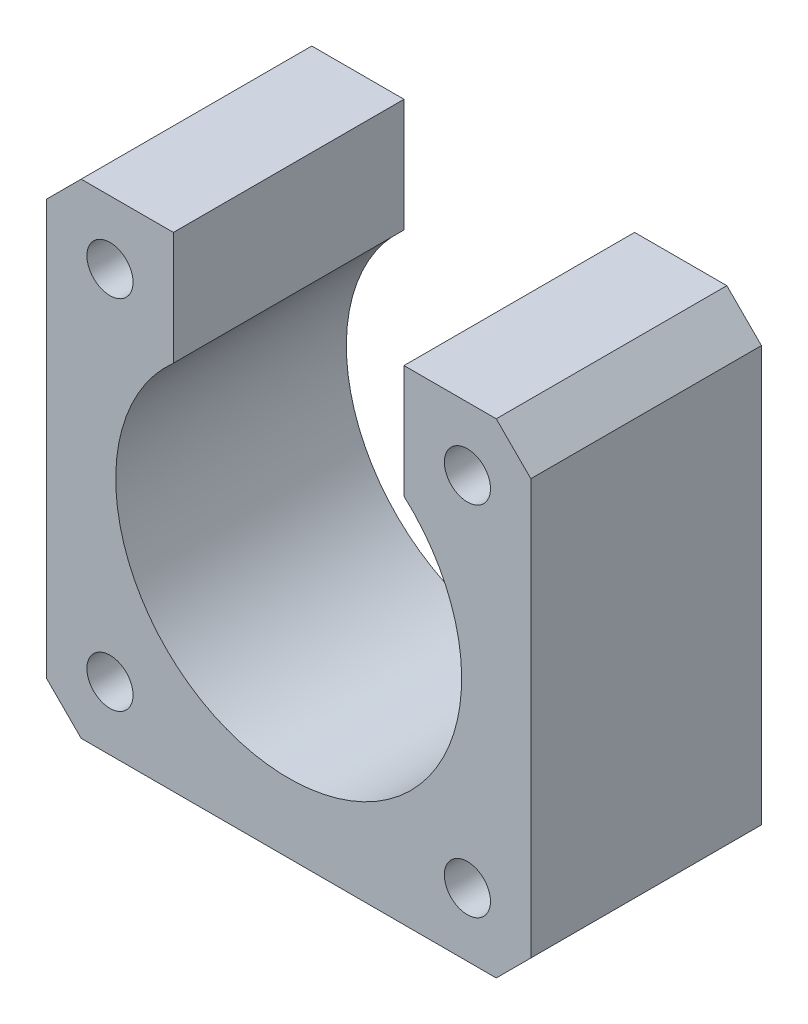
ISO-10303-21;
HEADER;
FILE_DESCRIPTION(('STEP AP214'),'2;1');
FILE_NAME('part.step','',(''),(''),'','','');
FILE_SCHEMA(('AUTOMOTIVE_DESIGN { 1 0 10303 214 1 1 1 1 }'));
ENDSEC;
DATA;
#1=APPLICATION_CONTEXT('core data for automotive mechanical design processes');
#2=APPLICATION_PROTOCOL_DEFINITION('international standard','automotive_design',2000,#1);
#3=PRODUCT_CONTEXT('',#1,'mechanical');
#4=PRODUCT('Part','Part','',(#3));
#5=PRODUCT_RELATED_PRODUCT_CATEGORY('part','',(#4));
#6=PRODUCT_DEFINITION_FORMATION('','',#4);
#7=PRODUCT_DEFINITION_CONTEXT('part definition',#1,'design');
#8=PRODUCT_DEFINITION('design','',#6,#7);
#9=PRODUCT_DEFINITION_SHAPE('','',#8);
#10=(LENGTH_UNIT() NAMED_UNIT(*) SI_UNIT(.MILLI.,.METRE.));
#11=(NAMED_UNIT(*) PLANE_ANGLE_UNIT() SI_UNIT($,.RADIAN.));
#12=(NAMED_UNIT(*) SI_UNIT($,.STERADIAN.) SOLID_ANGLE_UNIT());
#13=UNCERTAINTY_MEASURE_WITH_UNIT(LENGTH_MEASURE(1.E-05),#10,'distance_accuracy_value','');
#14=(GEOMETRIC_REPRESENTATION_CONTEXT(3) GLOBAL_UNCERTAINTY_ASSIGNED_CONTEXT((#13)) GLOBAL_UNIT_ASSIGNED_CONTEXT((#10,
#11,#12)) REPRESENTATION_CONTEXT('',''));
#15=CARTESIAN_POINT('',(0.,0.,0.));
#16=DIRECTION('',(0.,0.,1.));
#17=DIRECTION('',(1.,0.,0.));
#18=AXIS2_PLACEMENT_3D('',#15,#16,#17);
#19=CARTESIAN_POINT('',(0.,0.,20.));
#20=DIRECTION('',(0.,0.,1.));
#21=DIRECTION('',(1.,0.,0.));
#22=AXIS2_PLACEMENT_3D('',#19,#20,#21);
#23=PLANE('',#22);
#24=CARTESIAN_POINT('',(-15.5,-15.5,20.));
#25=DIRECTION('',(0.,0.,1.));
#26=DIRECTION('',(1.,0.,0.));
#27=AXIS2_PLACEMENT_3D('',#24,#25,#26);
#28=CIRCLE('',#27,2.);
#29=CARTESIAN_POINT('',(-13.5,-15.5,20.));
#30=VERTEX_POINT('',#29);
#31=EDGE_CURVE('E294',#30,#30,#28,.T.);
#32=ORIENTED_EDGE('',*,*,#31,.F.);
#33=EDGE_LOOP('',(#32));
#34=FACE_BOUND('',#33,.T.);
#35=CARTESIAN_POINT('',(15.5,15.5,20.));
#36=DIRECTION('',(0.,0.,1.));
#37=DIRECTION('',(1.,0.,0.));
#38=AXIS2_PLACEMENT_3D('',#35,#36,#37);
#39=CIRCLE('',#38,2.);
#40=CARTESIAN_POINT('',(17.5,15.5,20.));
#41=VERTEX_POINT('',#40);
#42=EDGE_CURVE('E160',#41,#41,#39,.T.);
#43=ORIENTED_EDGE('',*,*,#42,.F.);
#44=EDGE_LOOP('',(#43));
#45=FACE_BOUND('',#44,.T.);
#46=DIRECTION('',(0.,-1.,0.));
#47=VECTOR('',#46,1.);
#48=CARTESIAN_POINT('',(-21.,-18.,20.));
#49=LINE('',#48,#47);
#50=CARTESIAN_POINT('',(-21.,18.,20.));
#51=VERTEX_POINT('',#50);
#52=CARTESIAN_POINT('',(-21.,-18.,20.));
#53=VERTEX_POINT('',#52);
#54=EDGE_CURVE('E179',#51,#53,#49,.T.);
#55=ORIENTED_EDGE('',*,*,#54,.T.);
#56=DIRECTION('',(0.707106781186548,-0.707106781186548,0.));
#57=VECTOR('',#56,1.);
#58=CARTESIAN_POINT('',(-21.,-18.,20.));
#59=LINE('',#58,#57);
#60=CARTESIAN_POINT('',(-18.,-21.,20.));
#61=VERTEX_POINT('',#60);
#62=EDGE_CURVE('E107',#53,#61,#59,.T.);
#63=ORIENTED_EDGE('',*,*,#62,.T.);
#64=DIRECTION('',(1.,0.,0.));
#65=VECTOR('',#64,1.);
#66=CARTESIAN_POINT('',(-18.,-21.,20.));
#67=LINE('',#66,#65);
#68=CARTESIAN_POINT('',(18.,-21.,20.));
#69=VERTEX_POINT('',#68);
#70=EDGE_CURVE('E206',#61,#69,#67,.T.);
#71=ORIENTED_EDGE('',*,*,#70,.T.);
#72=DIRECTION('',(0.707106781186548,0.707106781186548,0.));
#73=VECTOR('',#72,1.);
#74=CARTESIAN_POINT('',(18.,-21.,20.));
#75=LINE('',#74,#73);
#76=CARTESIAN_POINT('',(21.,-18.,20.));
#77=VERTEX_POINT('',#76);
#78=EDGE_CURVE('E225',#69,#77,#75,.T.);
#79=ORIENTED_EDGE('',*,*,#78,.T.);
#80=DIRECTION('',(0.,1.,0.));
#81=VECTOR('',#80,1.);
#82=CARTESIAN_POINT('',(21.,-18.,20.));
#83=LINE('',#82,#81);
#84=CARTESIAN_POINT('',(21.,18.,20.));
#85=VERTEX_POINT('',#84);
#86=EDGE_CURVE('E222',#77,#85,#83,.T.);
#87=ORIENTED_EDGE('',*,*,#86,.T.);
#88=DIRECTION('',(-0.707106781186548,0.707106781186548,0.));
#89=VECTOR('',#88,1.);
#90=CARTESIAN_POINT('',(18.,21.,20.));
#91=LINE('',#90,#89);
#92=CARTESIAN_POINT('',(18.,21.,20.));
#93=VERTEX_POINT('',#92);
#94=EDGE_CURVE('E224',#85,#93,#91,.T.);
#95=ORIENTED_EDGE('',*,*,#94,.T.);
#96=DIRECTION('',(-1.,0.,0.));
#97=VECTOR('',#96,1.);
#98=CARTESIAN_POINT('',(10.,21.,20.));
#99=LINE('',#98,#97);
#100=CARTESIAN_POINT('',(10.,21.,20.));
#101=VERTEX_POINT('',#100);
#102=EDGE_CURVE('E227',#93,#101,#99,.T.);
#103=ORIENTED_EDGE('',*,*,#102,.T.);
#104=DIRECTION('',(0.,-1.,0.));
#105=VECTOR('',#104,1.);
#106=CARTESIAN_POINT('',(10.,21.,20.));
#107=LINE('',#106,#105);
#108=CARTESIAN_POINT('',(10.,11.180339887499,20.));
#109=VERTEX_POINT('',#108);
#110=EDGE_CURVE('E233',#101,#109,#107,.T.);
#111=ORIENTED_EDGE('',*,*,#110,.T.);
#112=CARTESIAN_POINT('',(0.,0.,20.));
#113=DIRECTION('',(0.,0.,-1.));
#114=DIRECTION('',(1.,0.,0.));
#115=AXIS2_PLACEMENT_3D('',#112,#113,#114);
#116=CIRCLE('',#115,15.);
#117=CARTESIAN_POINT('',(-10.,11.180339887499,20.));
#118=VERTEX_POINT('',#117);
#119=EDGE_CURVE('E138',#109,#118,#116,.T.);
#120=ORIENTED_EDGE('',*,*,#119,.T.);
#121=DIRECTION('',(0.,1.,0.));
#122=VECTOR('',#121,1.);
#123=CARTESIAN_POINT('',(-10.,21.,20.));
#124=LINE('',#123,#122);
#125=CARTESIAN_POINT('',(-10.,21.,20.));
#126=VERTEX_POINT('',#125);
#127=EDGE_CURVE('E132',#118,#126,#124,.T.);
#128=ORIENTED_EDGE('',*,*,#127,.T.);
#129=DIRECTION('',(-1.,0.,0.));
#130=VECTOR('',#129,1.);
#131=CARTESIAN_POINT('',(-18.,21.,20.));
#132=LINE('',#131,#130);
#133=CARTESIAN_POINT('',(-18.,21.,20.));
#134=VERTEX_POINT('',#133);
#135=EDGE_CURVE('E136',#126,#134,#132,.T.);
#136=ORIENTED_EDGE('',*,*,#135,.T.);
#137=DIRECTION('',(-0.707106781186548,-0.707106781186548,0.));
#138=VECTOR('',#137,1.);
#139=CARTESIAN_POINT('',(-21.,18.,20.));
#140=LINE('',#139,#138);
#141=EDGE_CURVE('E52',#134,#51,#140,.T.);
#142=ORIENTED_EDGE('',*,*,#141,.T.);
#143=EDGE_LOOP('',(#55,#63,#71,#79,#87,#95,#103,#111,#120,#128,#136,#142));
#144=FACE_BOUND('',#143,.T.);
#145=CARTESIAN_POINT('',(15.5,-15.5,20.));
#146=DIRECTION('',(0.,0.,1.));
#147=DIRECTION('',(1.,0.,0.));
#148=AXIS2_PLACEMENT_3D('',#145,#146,#147);
#149=CIRCLE('',#148,2.);
#150=CARTESIAN_POINT('',(17.5,-15.5,20.));
#151=VERTEX_POINT('',#150);
#152=EDGE_CURVE('E300',#151,#151,#149,.T.);
#153=ORIENTED_EDGE('',*,*,#152,.F.);
#154=EDGE_LOOP('',(#153));
#155=FACE_BOUND('',#154,.T.);
#156=CARTESIAN_POINT('',(-15.5,15.5,20.));
#157=DIRECTION('',(0.,0.,1.));
#158=DIRECTION('',(1.,0.,0.));
#159=AXIS2_PLACEMENT_3D('',#156,#157,#158);
#160=CIRCLE('',#159,2.);
#161=CARTESIAN_POINT('',(-13.5,15.5,20.));
#162=VERTEX_POINT('',#161);
#163=EDGE_CURVE('E285',#162,#162,#160,.T.);
#164=ORIENTED_EDGE('',*,*,#163,.F.);
#165=EDGE_LOOP('',(#164));
#166=FACE_BOUND('',#165,.T.);
#167=ADVANCED_FACE('F35',(#34,#45,#144,#155,#166),#23,.T.);
#168=CARTESIAN_POINT('',(0.,0.,0.));
#169=DIRECTION('',(0.,0.,1.));
#170=DIRECTION('',(1.,0.,0.));
#171=AXIS2_PLACEMENT_3D('',#168,#169,#170);
#172=PLANE('',#171);
#173=CARTESIAN_POINT('',(-15.5,-15.5,0.));
#174=DIRECTION('',(0.,0.,1.));
#175=DIRECTION('',(1.,0.,0.));
#176=AXIS2_PLACEMENT_3D('',#173,#174,#175);
#177=CIRCLE('',#176,2.);
#178=CARTESIAN_POINT('',(-13.5,-15.5,0.));
#179=VERTEX_POINT('',#178);
#180=EDGE_CURVE('E291',#179,#179,#177,.T.);
#181=ORIENTED_EDGE('',*,*,#180,.T.);
#182=EDGE_LOOP('',(#181));
#183=FACE_BOUND('',#182,.T.);
#184=CARTESIAN_POINT('',(15.5,15.5,0.));
#185=DIRECTION('',(0.,0.,1.));
#186=DIRECTION('',(1.,0.,0.));
#187=AXIS2_PLACEMENT_3D('',#184,#185,#186);
#188=CIRCLE('',#187,2.);
#189=CARTESIAN_POINT('',(17.5,15.5,0.));
#190=VERTEX_POINT('',#189);
#191=EDGE_CURVE('E303',#190,#190,#188,.T.);
#192=ORIENTED_EDGE('',*,*,#191,.T.);
#193=EDGE_LOOP('',(#192));
#194=FACE_BOUND('',#193,.T.);
#195=DIRECTION('',(0.,-1.,0.));
#196=VECTOR('',#195,1.);
#197=CARTESIAN_POINT('',(-21.,-18.,0.));
#198=LINE('',#197,#196);
#199=CARTESIAN_POINT('',(-21.,18.,0.));
#200=VERTEX_POINT('',#199);
#201=CARTESIAN_POINT('',(-21.,-18.,0.));
#202=VERTEX_POINT('',#201);
#203=EDGE_CURVE('E156',#200,#202,#198,.T.);
#204=ORIENTED_EDGE('',*,*,#203,.F.);
#205=DIRECTION('',(-0.707106781186548,-0.707106781186548,0.));
#206=VECTOR('',#205,1.);
#207=CARTESIAN_POINT('',(-21.,18.,0.));
#208=LINE('',#207,#206);
#209=CARTESIAN_POINT('',(-18.,21.,0.));
#210=VERTEX_POINT('',#209);
#211=EDGE_CURVE('E99',#210,#200,#208,.T.);
#212=ORIENTED_EDGE('',*,*,#211,.F.);
#213=DIRECTION('',(-1.,0.,0.));
#214=VECTOR('',#213,1.);
#215=CARTESIAN_POINT('',(-18.,21.,0.));
#216=LINE('',#215,#214);
#217=CARTESIAN_POINT('',(-10.,21.,0.));
#218=VERTEX_POINT('',#217);
#219=EDGE_CURVE('E93',#218,#210,#216,.T.);
#220=ORIENTED_EDGE('',*,*,#219,.F.);
#221=DIRECTION('',(0.,1.,0.));
#222=VECTOR('',#221,1.);
#223=CARTESIAN_POINT('',(-10.,21.,0.));
#224=LINE('',#223,#222);
#225=CARTESIAN_POINT('',(-10.,11.180339887499,0.));
#226=VERTEX_POINT('',#225);
#227=EDGE_CURVE('E146',#226,#218,#224,.T.);
#228=ORIENTED_EDGE('',*,*,#227,.F.);
#229=CARTESIAN_POINT('',(0.,0.,0.));
#230=DIRECTION('',(0.,0.,-1.));
#231=DIRECTION('',(1.,0.,0.));
#232=AXIS2_PLACEMENT_3D('',#229,#230,#231);
#233=CIRCLE('',#232,15.);
#234=CARTESIAN_POINT('',(10.,11.180339887499,0.));
#235=VERTEX_POINT('',#234);
#236=EDGE_CURVE('E174',#235,#226,#233,.T.);
#237=ORIENTED_EDGE('',*,*,#236,.F.);
#238=DIRECTION('',(0.,-1.,0.));
#239=VECTOR('',#238,1.);
#240=CARTESIAN_POINT('',(10.,21.,0.));
#241=LINE('',#240,#239);
#242=CARTESIAN_POINT('',(10.,21.,0.));
#243=VERTEX_POINT('',#242);
#244=EDGE_CURVE('E172',#243,#235,#241,.T.);
#245=ORIENTED_EDGE('',*,*,#244,.F.);
#246=DIRECTION('',(-1.,0.,0.));
#247=VECTOR('',#246,1.);
#248=CARTESIAN_POINT('',(10.,21.,0.));
#249=LINE('',#248,#247);
#250=CARTESIAN_POINT('',(18.,21.,0.));
#251=VERTEX_POINT('',#250);
#252=EDGE_CURVE('E170',#251,#243,#249,.T.);
#253=ORIENTED_EDGE('',*,*,#252,.F.);
#254=DIRECTION('',(-0.707106781186548,0.707106781186548,0.));
#255=VECTOR('',#254,1.);
#256=CARTESIAN_POINT('',(18.,21.,0.));
#257=LINE('',#256,#255);
#258=CARTESIAN_POINT('',(21.,18.,0.));
#259=VERTEX_POINT('',#258);
#260=EDGE_CURVE('E168',#259,#251,#257,.T.);
#261=ORIENTED_EDGE('',*,*,#260,.F.);
#262=DIRECTION('',(0.,1.,0.));
#263=VECTOR('',#262,1.);
#264=CARTESIAN_POINT('',(21.,-18.,0.));
#265=LINE('',#264,#263);
#266=CARTESIAN_POINT('',(21.,-18.,0.));
#267=VERTEX_POINT('',#266);
#268=EDGE_CURVE('E166',#267,#259,#265,.T.);
#269=ORIENTED_EDGE('',*,*,#268,.F.);
#270=DIRECTION('',(0.707106781186548,0.707106781186548,0.));
#271=VECTOR('',#270,1.);
#272=CARTESIAN_POINT('',(18.,-21.,0.));
#273=LINE('',#272,#271);
#274=CARTESIAN_POINT('',(18.,-21.,0.));
#275=VERTEX_POINT('',#274);
#276=EDGE_CURVE('E164',#275,#267,#273,.T.);
#277=ORIENTED_EDGE('',*,*,#276,.F.);
#278=DIRECTION('',(1.,0.,0.));
#279=VECTOR('',#278,1.);
#280=CARTESIAN_POINT('',(-18.,-21.,0.));
#281=LINE('',#280,#279);
#282=CARTESIAN_POINT('',(-18.,-21.,0.));
#283=VERTEX_POINT('',#282);
#284=EDGE_CURVE('E162',#283,#275,#281,.T.);
#285=ORIENTED_EDGE('',*,*,#284,.F.);
#286=DIRECTION('',(0.707106781186548,-0.707106781186548,0.));
#287=VECTOR('',#286,1.);
#288=CARTESIAN_POINT('',(-21.,-18.,0.));
#289=LINE('',#288,#287);
#290=EDGE_CURVE('E159',#202,#283,#289,.T.);
#291=ORIENTED_EDGE('',*,*,#290,.F.);
#292=EDGE_LOOP('',(#204,#212,#220,#228,#237,#245,#253,#261,#269,#277,#285,#291));
#293=FACE_BOUND('',#292,.T.);
#294=CARTESIAN_POINT('',(15.5,-15.5,0.));
#295=DIRECTION('',(0.,0.,1.));
#296=DIRECTION('',(1.,0.,0.));
#297=AXIS2_PLACEMENT_3D('',#294,#295,#296);
#298=CIRCLE('',#297,2.);
#299=CARTESIAN_POINT('',(17.5,-15.5,0.));
#300=VERTEX_POINT('',#299);
#301=EDGE_CURVE('E297',#300,#300,#298,.T.);
#302=ORIENTED_EDGE('',*,*,#301,.T.);
#303=EDGE_LOOP('',(#302));
#304=FACE_BOUND('',#303,.T.);
#305=CARTESIAN_POINT('',(-15.5,15.5,0.));
#306=DIRECTION('',(0.,0.,1.));
#307=DIRECTION('',(1.,0.,0.));
#308=AXIS2_PLACEMENT_3D('',#305,#306,#307);
#309=CIRCLE('',#308,2.);
#310=CARTESIAN_POINT('',(-13.5,15.5,0.));
#311=VERTEX_POINT('',#310);
#312=EDGE_CURVE('E288',#311,#311,#309,.T.);
#313=ORIENTED_EDGE('',*,*,#312,.T.);
#314=EDGE_LOOP('',(#313));
#315=FACE_BOUND('',#314,.T.);
#316=ADVANCED_FACE('F210',(#183,#194,#293,#304,#315),#172,.F.);
#317=CARTESIAN_POINT('',(-21.,-18.,20.));
#318=DIRECTION('',(1.,0.,0.));
#319=DIRECTION('',(0.,0.,-1.));
#320=AXIS2_PLACEMENT_3D('',#317,#318,#319);
#321=PLANE('',#320);
#322=ORIENTED_EDGE('',*,*,#203,.T.);
#323=DIRECTION('',(0.,0.,-1.));
#324=VECTOR('',#323,1.);
#325=CARTESIAN_POINT('',(-21.,-18.,20.));
#326=LINE('',#325,#324);
#327=EDGE_CURVE('E11',#53,#202,#326,.T.);
#328=ORIENTED_EDGE('',*,*,#327,.F.);
#329=ORIENTED_EDGE('',*,*,#54,.F.);
#330=DIRECTION('',(0.,0.,-1.));
#331=VECTOR('',#330,1.);
#332=CARTESIAN_POINT('',(-21.,18.,20.));
#333=LINE('',#332,#331);
#334=EDGE_CURVE('E152',#51,#200,#333,.T.);
#335=ORIENTED_EDGE('',*,*,#334,.T.);
#336=EDGE_LOOP('',(#322,#328,#329,#335));
#337=FACE_BOUND('',#336,.T.);
#338=ADVANCED_FACE('F37',(#337),#321,.F.);
#339=CARTESIAN_POINT('',(-21.,-18.,20.));
#340=DIRECTION('',(0.707106781186548,0.707106781186548,0.));
#341=DIRECTION('',(-0.707106781186548,0.707106781186548,0.));
#342=AXIS2_PLACEMENT_3D('',#339,#340,#341);
#343=PLANE('',#342);
#344=ORIENTED_EDGE('',*,*,#290,.T.);
#345=DIRECTION('',(0.,0.,-1.));
#346=VECTOR('',#345,1.);
#347=CARTESIAN_POINT('',(-18.,-21.,20.));
#348=LINE('',#347,#346);
#349=EDGE_CURVE('E44',#61,#283,#348,.T.);
#350=ORIENTED_EDGE('',*,*,#349,.F.);
#351=ORIENTED_EDGE('',*,*,#62,.F.);
#352=ORIENTED_EDGE('',*,*,#327,.T.);
#353=EDGE_LOOP('',(#344,#350,#351,#352));
#354=FACE_BOUND('',#353,.T.);
#355=ADVANCED_FACE('F412',(#354),#343,.F.);
#356=CARTESIAN_POINT('',(-18.,-21.,20.));
#357=DIRECTION('',(0.,1.,0.));
#358=DIRECTION('',(0.,0.,1.));
#359=AXIS2_PLACEMENT_3D('',#356,#357,#358);
#360=PLANE('',#359);
#361=ORIENTED_EDGE('',*,*,#284,.T.);
#362=DIRECTION('',(0.,0.,-1.));
#363=VECTOR('',#362,1.);
#364=CARTESIAN_POINT('',(18.,-21.,20.));
#365=LINE('',#364,#363);
#366=EDGE_CURVE('E198',#69,#275,#365,.T.);
#367=ORIENTED_EDGE('',*,*,#366,.F.);
#368=ORIENTED_EDGE('',*,*,#70,.F.);
#369=ORIENTED_EDGE('',*,*,#349,.T.);
#370=EDGE_LOOP('',(#361,#367,#368,#369));
#371=FACE_BOUND('',#370,.T.);
#372=ADVANCED_FACE('F204',(#371),#360,.F.);
#373=CARTESIAN_POINT('',(18.,-21.,20.));
#374=DIRECTION('',(-0.707106781186548,0.707106781186548,0.));
#375=DIRECTION('',(-0.707106781186548,-0.707106781186548,0.));
#376=AXIS2_PLACEMENT_3D('',#373,#374,#375);
#377=PLANE('',#376);
#378=ORIENTED_EDGE('',*,*,#276,.T.);
#379=DIRECTION('',(0.,0.,-1.));
#380=VECTOR('',#379,1.);
#381=CARTESIAN_POINT('',(21.,-18.,20.));
#382=LINE('',#381,#380);
#383=EDGE_CURVE('E195',#77,#267,#382,.T.);
#384=ORIENTED_EDGE('',*,*,#383,.F.);
#385=ORIENTED_EDGE('',*,*,#78,.F.);
#386=ORIENTED_EDGE('',*,*,#366,.T.);
#387=EDGE_LOOP('',(#378,#384,#385,#386));
#388=FACE_BOUND('',#387,.T.);
#389=ADVANCED_FACE('F216',(#388),#377,.F.);
#390=CARTESIAN_POINT('',(21.,-18.,20.));
#391=DIRECTION('',(-1.,0.,0.));
#392=DIRECTION('',(0.,0.,1.));
#393=AXIS2_PLACEMENT_3D('',#390,#391,#392);
#394=PLANE('',#393);
#395=ORIENTED_EDGE('',*,*,#268,.T.);
#396=DIRECTION('',(0.,0.,-1.));
#397=VECTOR('',#396,1.);
#398=CARTESIAN_POINT('',(21.,18.,20.));
#399=LINE('',#398,#397);
#400=EDGE_CURVE('E192',#85,#259,#399,.T.);
#401=ORIENTED_EDGE('',*,*,#400,.F.);
#402=ORIENTED_EDGE('',*,*,#86,.F.);
#403=ORIENTED_EDGE('',*,*,#383,.T.);
#404=EDGE_LOOP('',(#395,#401,#402,#403));
#405=FACE_BOUND('',#404,.T.);
#406=ADVANCED_FACE('F220',(#405),#394,.F.);
#407=CARTESIAN_POINT('',(18.,21.,20.));
#408=DIRECTION('',(-0.707106781186548,-0.707106781186548,0.));
#409=DIRECTION('',(0.707106781186548,-0.707106781186548,0.));
#410=AXIS2_PLACEMENT_3D('',#407,#408,#409);
#411=PLANE('',#410);
#412=ORIENTED_EDGE('',*,*,#260,.T.);
#413=DIRECTION('',(0.,0.,-1.));
#414=VECTOR('',#413,1.);
#415=CARTESIAN_POINT('',(18.,21.,20.));
#416=LINE('',#415,#414);
#417=EDGE_CURVE('E189',#93,#251,#416,.T.);
#418=ORIENTED_EDGE('',*,*,#417,.F.);
#419=ORIENTED_EDGE('',*,*,#94,.F.);
#420=ORIENTED_EDGE('',*,*,#400,.T.);
#421=EDGE_LOOP('',(#412,#418,#419,#420));
#422=FACE_BOUND('',#421,.T.);
#423=ADVANCED_FACE('F377',(#422),#411,.F.);
#424=CARTESIAN_POINT('',(10.,21.,20.));
#425=DIRECTION('',(0.,-1.,0.));
#426=DIRECTION('',(0.,0.,-1.));
#427=AXIS2_PLACEMENT_3D('',#424,#425,#426);
#428=PLANE('',#427);
#429=ORIENTED_EDGE('',*,*,#252,.T.);
#430=DIRECTION('',(0.,0.,-1.));
#431=VECTOR('',#430,1.);
#432=CARTESIAN_POINT('',(10.,21.,20.));
#433=LINE('',#432,#431);
#434=EDGE_CURVE('E186',#101,#243,#433,.T.);
#435=ORIENTED_EDGE('',*,*,#434,.F.);
#436=ORIENTED_EDGE('',*,*,#102,.F.);
#437=ORIENTED_EDGE('',*,*,#417,.T.);
#438=EDGE_LOOP('',(#429,#435,#436,#437));
#439=FACE_BOUND('',#438,.T.);
#440=ADVANCED_FACE('F368',(#439),#428,.F.);
#441=CARTESIAN_POINT('',(10.,21.,20.));
#442=DIRECTION('',(1.,0.,0.));
#443=DIRECTION('',(0.,0.,-1.));
#444=AXIS2_PLACEMENT_3D('',#441,#442,#443);
#445=PLANE('',#444);
#446=ORIENTED_EDGE('',*,*,#244,.T.);
#447=DIRECTION('',(0.,0.,-1.));
#448=VECTOR('',#447,1.);
#449=CARTESIAN_POINT('',(10.,11.180339887499,20.));
#450=LINE('',#449,#448);
#451=EDGE_CURVE('E183',#109,#235,#450,.T.);
#452=ORIENTED_EDGE('',*,*,#451,.F.);
#453=ORIENTED_EDGE('',*,*,#110,.F.);
#454=ORIENTED_EDGE('',*,*,#434,.T.);
#455=EDGE_LOOP('',(#446,#452,#453,#454));
#456=FACE_BOUND('',#455,.T.);
#457=ADVANCED_FACE('F239',(#456),#445,.F.);
#458=CARTESIAN_POINT('',(0.,0.,20.));
#459=DIRECTION('',(0.,0.,-1.));
#460=DIRECTION('',(-1.,0.,0.));
#461=AXIS2_PLACEMENT_3D('',#458,#459,#460);
#462=CYLINDRICAL_SURFACE('',#461,15.);
#463=ORIENTED_EDGE('',*,*,#236,.T.);
#464=DIRECTION('',(0.,0.,-1.));
#465=VECTOR('',#464,1.);
#466=CARTESIAN_POINT('',(-10.,11.180339887499,20.));
#467=LINE('',#466,#465);
#468=EDGE_CURVE('E147',#118,#226,#467,.T.);
#469=ORIENTED_EDGE('',*,*,#468,.F.);
#470=ORIENTED_EDGE('',*,*,#119,.F.);
#471=ORIENTED_EDGE('',*,*,#451,.T.);
#472=EDGE_LOOP('',(#463,#469,#470,#471));
#473=FACE_BOUND('',#472,.T.);
#474=ADVANCED_FACE('F243',(#473),#462,.F.);
#475=CARTESIAN_POINT('',(-10.,21.,20.));
#476=DIRECTION('',(-1.,0.,0.));
#477=DIRECTION('',(0.,0.,1.));
#478=AXIS2_PLACEMENT_3D('',#475,#476,#477);
#479=PLANE('',#478);
#480=ORIENTED_EDGE('',*,*,#227,.T.);
#481=DIRECTION('',(0.,0.,-1.));
#482=VECTOR('',#481,1.);
#483=CARTESIAN_POINT('',(-10.,21.,20.));
#484=LINE('',#483,#482);
#485=EDGE_CURVE('E143',#126,#218,#484,.T.);
#486=ORIENTED_EDGE('',*,*,#485,.F.);
#487=ORIENTED_EDGE('',*,*,#127,.F.);
#488=ORIENTED_EDGE('',*,*,#468,.T.);
#489=EDGE_LOOP('',(#480,#486,#487,#488));
#490=FACE_BOUND('',#489,.T.);
#491=ADVANCED_FACE('F144',(#490),#479,.F.);
#492=CARTESIAN_POINT('',(-18.,21.,20.));
#493=DIRECTION('',(0.,-1.,0.));
#494=DIRECTION('',(0.,0.,-1.));
#495=AXIS2_PLACEMENT_3D('',#492,#493,#494);
#496=PLANE('',#495);
#497=ORIENTED_EDGE('',*,*,#219,.T.);
#498=DIRECTION('',(0.,0.,-1.));
#499=VECTOR('',#498,1.);
#500=CARTESIAN_POINT('',(-18.,21.,20.));
#501=LINE('',#500,#499);
#502=EDGE_CURVE('E148',#134,#210,#501,.T.);
#503=ORIENTED_EDGE('',*,*,#502,.F.);
#504=ORIENTED_EDGE('',*,*,#135,.F.);
#505=ORIENTED_EDGE('',*,*,#485,.T.);
#506=EDGE_LOOP('',(#497,#503,#504,#505));
#507=FACE_BOUND('',#506,.T.);
#508=ADVANCED_FACE('F150',(#507),#496,.F.);
#509=CARTESIAN_POINT('',(-21.,18.,20.));
#510=DIRECTION('',(0.707106781186548,-0.707106781186548,0.));
#511=DIRECTION('',(0.707106781186548,0.707106781186548,0.));
#512=AXIS2_PLACEMENT_3D('',#509,#510,#511);
#513=PLANE('',#512);
#514=ORIENTED_EDGE('',*,*,#211,.T.);
#515=ORIENTED_EDGE('',*,*,#334,.F.);
#516=ORIENTED_EDGE('',*,*,#141,.F.);
#517=ORIENTED_EDGE('',*,*,#502,.T.);
#518=EDGE_LOOP('',(#514,#515,#516,#517));
#519=FACE_BOUND('',#518,.T.);
#520=ADVANCED_FACE('F247',(#519),#513,.F.);
#521=CARTESIAN_POINT('',(15.5,15.5,20.));
#522=DIRECTION('',(0.,0.,-1.));
#523=DIRECTION('',(-1.,0.,0.));
#524=AXIS2_PLACEMENT_3D('',#521,#522,#523);
#525=CYLINDRICAL_SURFACE('',#524,2.);
#526=ORIENTED_EDGE('',*,*,#42,.T.);
#527=EDGE_LOOP('',(#526));
#528=FACE_BOUND('',#527,.T.);
#529=ORIENTED_EDGE('',*,*,#191,.F.);
#530=EDGE_LOOP('',(#529));
#531=FACE_BOUND('',#530,.T.);
#532=ADVANCED_FACE('F249',(#528,#531),#525,.F.);
#533=CARTESIAN_POINT('',(15.5,-15.5,20.));
#534=DIRECTION('',(0.,0.,-1.));
#535=DIRECTION('',(-1.,0.,0.));
#536=AXIS2_PLACEMENT_3D('',#533,#534,#535);
#537=CYLINDRICAL_SURFACE('',#536,2.);
#538=ORIENTED_EDGE('',*,*,#152,.T.);
#539=EDGE_LOOP('',(#538));
#540=FACE_BOUND('',#539,.T.);
#541=ORIENTED_EDGE('',*,*,#301,.F.);
#542=EDGE_LOOP('',(#541));
#543=FACE_BOUND('',#542,.T.);
#544=ADVANCED_FACE('F255',(#540,#543),#537,.F.);
#545=CARTESIAN_POINT('',(-15.5,-15.5,20.));
#546=DIRECTION('',(0.,0.,-1.));
#547=DIRECTION('',(-1.,0.,0.));
#548=AXIS2_PLACEMENT_3D('',#545,#546,#547);
#549=CYLINDRICAL_SURFACE('',#548,2.);
#550=ORIENTED_EDGE('',*,*,#31,.T.);
#551=EDGE_LOOP('',(#550));
#552=FACE_BOUND('',#551,.T.);
#553=ORIENTED_EDGE('',*,*,#180,.F.);
#554=EDGE_LOOP('',(#553));
#555=FACE_BOUND('',#554,.T.);
#556=ADVANCED_FACE('F272',(#552,#555),#549,.F.);
#557=CARTESIAN_POINT('',(-15.5,15.5,20.));
#558=DIRECTION('',(0.,0.,-1.));
#559=DIRECTION('',(-1.,0.,0.));
#560=AXIS2_PLACEMENT_3D('',#557,#558,#559);
#561=CYLINDRICAL_SURFACE('',#560,2.);
#562=ORIENTED_EDGE('',*,*,#163,.T.);
#563=EDGE_LOOP('',(#562));
#564=FACE_BOUND('',#563,.T.);
#565=ORIENTED_EDGE('',*,*,#312,.F.);
#566=EDGE_LOOP('',(#565));
#567=FACE_BOUND('',#566,.T.);
#568=ADVANCED_FACE('F276',(#564,#567),#561,.F.);
#569=CLOSED_SHELL('',(#167,#316,#338,#355,#372,#389,#406,#423,#440,#457,#474,#491,#508,#520,
#532,#544,#556,#568));
#570=MANIFOLD_SOLID_BREP('B2',#569);
#571=ADVANCED_BREP_SHAPE_REPRESENTATION('',(#18,#570),#14);
#572=SHAPE_DEFINITION_REPRESENTATION(#9,#571);
ENDSEC;
END-ISO-10303-21;
